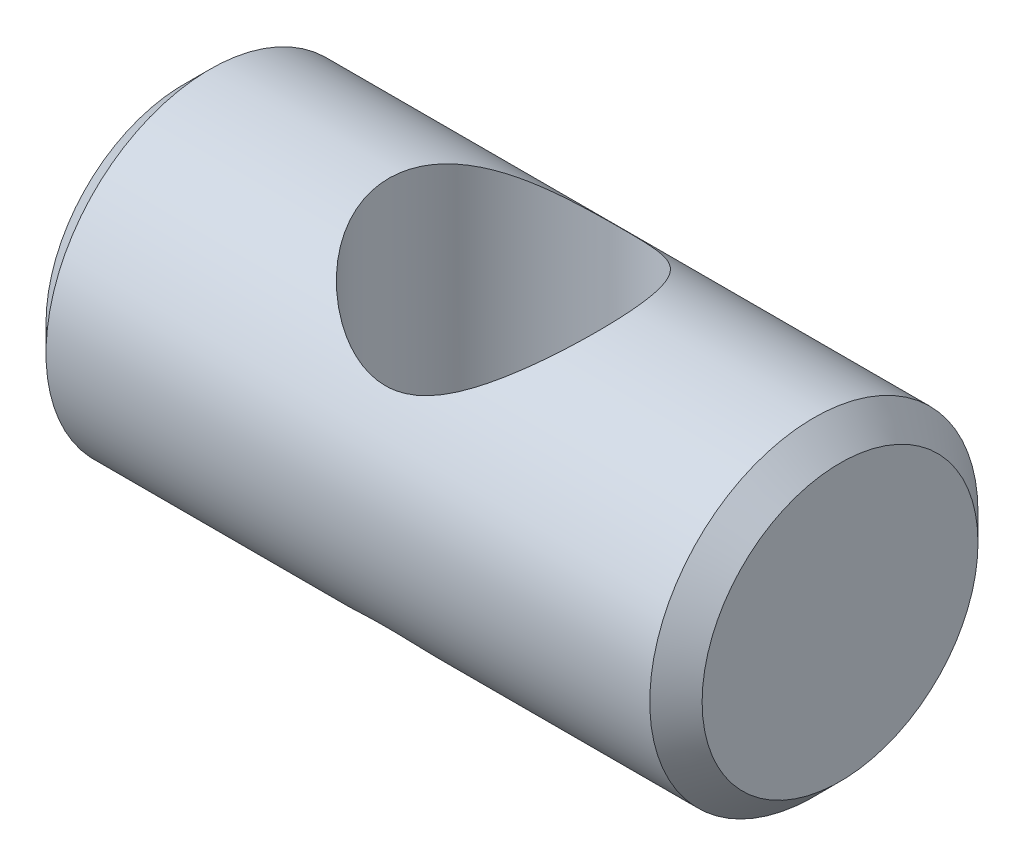
ISO-10303-21;
HEADER;
FILE_DESCRIPTION(('STEP AP214'),'2;1');
FILE_NAME('part.step','',(''),(''),'','','');
FILE_SCHEMA(('AUTOMOTIVE_DESIGN { 1 0 10303 214 1 1 1 1 }'));
ENDSEC;
DATA;
#1=APPLICATION_CONTEXT('core data for automotive mechanical design processes');
#2=APPLICATION_PROTOCOL_DEFINITION('international standard','automotive_design',2000,#1);
#3=PRODUCT_CONTEXT('',#1,'mechanical');
#4=PRODUCT('Part','Part','',(#3));
#5=PRODUCT_RELATED_PRODUCT_CATEGORY('part','',(#4));
#6=PRODUCT_DEFINITION_FORMATION('','',#4);
#7=PRODUCT_DEFINITION_CONTEXT('part definition',#1,'design');
#8=PRODUCT_DEFINITION('design','',#6,#7);
#9=PRODUCT_DEFINITION_SHAPE('','',#8);
#10=(LENGTH_UNIT() NAMED_UNIT(*) SI_UNIT(.MILLI.,.METRE.));
#11=(NAMED_UNIT(*) PLANE_ANGLE_UNIT() SI_UNIT($,.RADIAN.));
#12=(NAMED_UNIT(*) SI_UNIT($,.STERADIAN.) SOLID_ANGLE_UNIT());
#13=UNCERTAINTY_MEASURE_WITH_UNIT(LENGTH_MEASURE(1.E-05),#10,'distance_accuracy_value','');
#14=(GEOMETRIC_REPRESENTATION_CONTEXT(3) GLOBAL_UNCERTAINTY_ASSIGNED_CONTEXT((#13)) GLOBAL_UNIT_ASSIGNED_CONTEXT((#10,
#11,#12)) REPRESENTATION_CONTEXT('',''));
#15=CARTESIAN_POINT('',(0.,0.,0.));
#16=DIRECTION('',(0.,0.,1.));
#17=DIRECTION('',(1.,0.,0.));
#18=AXIS2_PLACEMENT_3D('',#15,#16,#17);
#19=CARTESIAN_POINT('',(9.525,0.,0.));
#20=DIRECTION('',(-1.,0.,0.));
#21=DIRECTION('',(0.,0.,1.));
#22=AXIS2_PLACEMENT_3D('',#19,#20,#21);
#23=CYLINDRICAL_SURFACE('',#22,4.765);
#24=CARTESIAN_POINT('',(-3.42087708051605,-4.765,0.));
#25=CARTESIAN_POINT('',(-3.42696899134863,-4.7649997101109,0.0833627581168182));
#26=CARTESIAN_POINT('',(-3.43001003086423,-4.76280757869707,0.166953392424251));
#27=CARTESIAN_POINT('',(-3.4299899120654,-4.75402028790231,0.333933182408653));
#28=CARTESIAN_POINT('',(-3.42692615604904,-4.74742325494959,0.41732223719261));
#29=CARTESIAN_POINT('',(-3.41478160746824,-4.72989865727235,0.583312250165057));
#30=CARTESIAN_POINT('',(-3.40569315136156,-4.71896558414041,0.665912068503747));
#31=CARTESIAN_POINT('',(-3.38168739143667,-4.69295834085159,0.829610597514772));
#32=CARTESIAN_POINT('',(-3.36676760565251,-4.67788240819801,0.91070865358331));
#33=CARTESIAN_POINT('',(-3.31382161536753,-4.62699847385246,1.15000632689336));
#34=CARTESIAN_POINT('',(-3.26752778272676,-4.58542013528299,1.30524951697123));
#35=CARTESIAN_POINT('',(-3.15544383432779,-4.48962808746058,1.60411463212557));
#36=CARTESIAN_POINT('',(-3.08965416222603,-4.43541466574349,1.74773682156028));
#37=CARTESIAN_POINT('',(-2.93522566350036,-4.31273538578719,2.03259497643689));
#38=CARTESIAN_POINT('',(-2.84518090003159,-4.24347672491827,2.17272279857911));
#39=CARTESIAN_POINT('',(-2.64803347355049,-4.09784606286129,2.43631552731587));
#40=CARTESIAN_POINT('',(-2.54091313456509,-4.02146672501527,2.55976291960052));
#41=CARTESIAN_POINT('',(-2.28757037498761,-3.84950291536883,2.81327393100644));
#42=CARTESIAN_POINT('',(-2.13784494064544,-3.75321839663728,2.93940806717613));
#43=CARTESIAN_POINT('',(-1.89774924473951,-3.61188607024724,3.10885207016274));
#44=CARTESIAN_POINT('',(-1.81509327318893,-3.56527135977744,3.16205944901992));
#45=CARTESIAN_POINT('',(-1.64456461914389,-3.47438917550769,3.26165283895997));
#46=CARTESIAN_POINT('',(-1.55669391813204,-3.43012082209568,3.30804141803447));
#47=CARTESIAN_POINT('',(-1.33801732923479,-3.32784018306176,3.41144333221737));
#48=CARTESIAN_POINT('',(-1.20454764001564,-3.27176419567389,3.46485738281701));
#49=CARTESIAN_POINT('',(-0.927567219273259,-3.17315327144381,3.55539465585279));
#50=CARTESIAN_POINT('',(-0.784080947165172,-3.13058666617785,3.59255605597934));
#51=CARTESIAN_POINT('',(-0.514646140223209,-3.07113542283653,3.64343651296181));
#52=CARTESIAN_POINT('',(-0.389980532152303,-3.05107413064414,3.66010628533956));
#53=CARTESIAN_POINT('',(-0.13805144197163,-3.02761567970702,3.67954153570878));
#54=CARTESIAN_POINT('',(-0.010790737951865,-3.02420155283186,3.68232117171679));
#55=CARTESIAN_POINT('',(0.242449329866106,-3.03458366659267,3.67376621747767));
#56=CARTESIAN_POINT('',(0.368429244158409,-3.04837216824954,3.66243797397314));
#57=CARTESIAN_POINT('',(0.615927376424317,-3.09094772918142,3.62657095184853));
#58=CARTESIAN_POINT('',(0.737438661719832,-3.11975712134959,3.60201250089043));
#59=CARTESIAN_POINT('',(1.02486117239319,-3.20358122773375,3.52797021750044));
#60=CARTESIAN_POINT('',(1.18741075414518,-3.26453704351351,3.47231020523667));
#61=CARTESIAN_POINT('',(1.498121783823,-3.39961296516166,3.34017866781708));
#62=CARTESIAN_POINT('',(1.64623815847782,-3.47377238661047,3.2636446149314));
#63=CARTESIAN_POINT('',(1.87825971607124,-3.60054284241464,3.12200897105521));
#64=CARTESIAN_POINT('',(1.9664324955114,-3.65156363596669,3.06234750531042));
#65=CARTESIAN_POINT('',(2.13658829521524,-3.75440484501345,2.93536296354977));
#66=CARTESIAN_POINT('',(2.21856944344932,-3.80622549668558,2.86803758566651));
#67=CARTESIAN_POINT('',(2.4548169203279,-3.96070606463684,2.65493557738645));
#68=CARTESIAN_POINT('',(2.59972905493882,-4.06258137631192,2.4978237985218));
#69=CARTESIAN_POINT('',(2.83706621766583,-4.23718725327564,2.18575837138569));
#70=CARTESIAN_POINT('',(2.93424360521689,-4.31186637762032,2.03548298499758));
#71=CARTESIAN_POINT('',(3.10568912436017,-4.44824656330391,1.71702572980925));
#72=CARTESIAN_POINT('',(3.17999040299218,-4.50996636079323,1.54887024912961));
#73=CARTESIAN_POINT('',(3.29263516387729,-4.60778480850806,1.22389848309853));
#74=CARTESIAN_POINT('',(3.33468022800881,-4.64632732736096,1.06910753325384));
#75=CARTESIAN_POINT('',(3.39687013419293,-4.70801774696666,0.752190984217971));
#76=CARTESIAN_POINT('',(3.4170259792185,-4.73117337991453,0.590069112764687));
#77=CARTESIAN_POINT('',(3.43390286080123,-4.7606051003247,0.262598143568303));
#78=CARTESIAN_POINT('',(3.43055828056669,-4.76683385814853,0.0972412962651645));
#79=CARTESIAN_POINT('',(3.40010195996678,-4.76222706928004,-0.231024129353292));
#80=CARTESIAN_POINT('',(3.37298745129903,-4.75138953488968,-0.393932420256085));
#81=CARTESIAN_POINT('',(3.29795083571309,-4.71498049061455,-0.705514268669748));
#82=CARTESIAN_POINT('',(3.25098003249397,-4.69006694126301,-0.854498752183594));
#83=CARTESIAN_POINT('',(3.13840780618742,-4.6283363468626,-1.14256413370517));
#84=CARTESIAN_POINT('',(3.07280276883643,-4.59151699239254,-1.28164310390504));
#85=CARTESIAN_POINT('',(2.91796402171938,-4.50478911028579,-1.5605913242394));
#86=CARTESIAN_POINT('',(2.82706121692328,-4.45396042558585,-1.6992420339739));
#87=CARTESIAN_POINT('',(2.62789389216064,-4.34533105232054,-1.96045324775842));
#88=CARTESIAN_POINT('',(2.51961335554432,-4.28752394420402,-2.08299871660834));
#89=CARTESIAN_POINT('',(2.26753986981794,-4.15886196775128,-2.33061071233595));
#90=CARTESIAN_POINT('',(2.12084350362776,-4.08747815085455,-2.4524560274696));
#91=CARTESIAN_POINT('',(1.80818256348861,-3.94818744226299,-2.67091966387117));
#92=CARTESIAN_POINT('',(1.64221717999394,-3.88028069682256,-2.76753692468302));
#93=CARTESIAN_POINT('',(1.32363316444147,-3.76775877390234,-2.91829752704228));
#94=CARTESIAN_POINT('',(1.17388770573105,-3.72114907301219,-2.97693831230802));
#95=CARTESIAN_POINT('',(0.94182658133829,-3.66180847873486,-3.04915600293589));
#96=CARTESIAN_POINT('',(0.863255129060431,-3.64379412637323,-3.0706008978109));
#97=CARTESIAN_POINT('',(0.703992654043785,-3.61197174564401,-3.10797188341904));
#98=CARTESIAN_POINT('',(0.62330269473567,-3.59816164910818,-3.12390068817333));
#99=CARTESIAN_POINT('',(0.459495462666014,-3.57524455910332,-3.15010468685879));
#100=CARTESIAN_POINT('',(0.376361962516611,-3.5661861203942,-3.16032158062367));
#101=CARTESIAN_POINT('',(0.209195138832908,-3.55344451616001,-3.17464168800661));
#102=CARTESIAN_POINT('',(0.125162274904953,-3.54975872585817,-3.17874788699032));
#103=CARTESIAN_POINT('',(-0.0430393452037676,-3.54795587812489,-3.18076053743013));
#104=CARTESIAN_POINT('',(-0.127208095972437,-3.54983860412504,-3.17866722999483));
#105=CARTESIAN_POINT('',(-0.29484062899608,-3.55905933774995,-3.16833758034575));
#106=CARTESIAN_POINT('',(-0.378304441298768,-3.56639711165655,-3.16010150131517));
#107=CARTESIAN_POINT('',(-0.604314657609785,-3.59341005189328,-3.129430196119));
#108=CARTESIAN_POINT('',(-0.745494317394036,-3.61818171011667,-3.10101793603989));
#109=CARTESIAN_POINT('',(-1.02069983126741,-3.67972750014127,-3.02771937958645));
#110=CARTESIAN_POINT('',(-1.1547183301723,-3.71651370639189,-2.98281650470617));
#111=CARTESIAN_POINT('',(-1.46853642894096,-3.8153502491925,-2.8560768918245));
#112=CARTESIAN_POINT('',(-1.64398166227299,-3.88152734494911,-2.76664814536404));
#113=CARTESIAN_POINT('',(-1.97551522842484,-4.02033820070584,-2.56077346334119));
#114=CARTESIAN_POINT('',(-2.13156938380249,-4.09298298410994,-2.44428083509274));
#115=CARTESIAN_POINT('',(-2.42421216807333,-4.2373970566927,-2.18450650401399));
#116=CARTESIAN_POINT('',(-2.56052605726515,-4.30914323590253,-2.04090097393914));
#117=CARTESIAN_POINT('',(-2.80802181758102,-4.44318432752427,-1.72973058522059));
#118=CARTESIAN_POINT('',(-2.91923707314103,-4.50549175797245,-1.56219804304703));
#119=CARTESIAN_POINT('',(-3.09396462152009,-4.60338031575656,-1.23969583506405));
#120=CARTESIAN_POINT('',(-3.16252149709776,-4.64178783933997,-1.08834922542924));
#121=CARTESIAN_POINT('',(-3.24875451241662,-4.68864069192958,-0.853387810710919));
#122=CARTESIAN_POINT('',(-3.27471971164357,-4.70245945854321,-0.773800863355168));
#123=CARTESIAN_POINT('',(-3.32087000112459,-4.72618391319332,-0.612411306870996));
#124=CARTESIAN_POINT('',(-3.34105760799584,-4.73609130567107,-0.530609679466056));
#125=CARTESIAN_POINT('',(-3.37353939001354,-4.75084997254152,-0.374335243630175));
#126=CARTESIAN_POINT('',(-3.38645258471521,-4.75613339853629,-0.300030947704157));
#127=CARTESIAN_POINT('',(-3.40736829831093,-4.76320900575073,-0.150546671086999));
#128=CARTESIAN_POINT('',(-3.41536951590209,-4.76500026208246,-0.075366463716097));
#129=CARTESIAN_POINT('',(-3.42087708051605,-4.765,0.));
#130=B_SPLINE_CURVE_WITH_KNOTS('',3,(#24,#25,#26,#27,#28,#29,#30,#31,#32,#33,#34,#35,#36,#37,
#38,#39,#40,#41,#42,#43,#44,#45,#46,#47,#48,#49,#50,#51,#52,#53,#54,#55,#56,#57,#58,#59,#60,#61,
#62,#63,#64,#65,#66,#67,#68,#69,#70,#71,#72,#73,#74,#75,#76,#77,#78,#79,#80,#81,#82,#83,#84,#85,
#86,#87,#88,#89,#90,#91,#92,#93,#94,#95,#96,#97,#98,#99,#100,#101,#102,#103,#104,#105,#106,#107,
#108,#109,#110,#111,#112,#113,#114,#115,#116,#117,#118,#119,#120,#121,#122,#123,#124,#125,#126,
#127,#128,#129),.UNSPECIFIED.,.T.,.F.,(4,2,2,2,2,2,2,2,2,2,2,2,2,2,2,2,2,2,2,2,2,2,2,2,2,2,2,2,
2,2,2,2,2,2,2,2,2,2,2,2,2,2,2,2,2,2,2,2,2,2,2,2,4),(0.,0.250678148817341,0.501462988541287,
0.752567445437253,1.00377889552888,1.50309474088369,2.00239922444642,2.54160992918404,
3.08138247258981,3.73300244855075,4.05909733145616,4.38506908912952,4.84654436743379,
5.30692973453839,5.68734604359481,6.06737452056514,6.44723209503533,6.82765605484285,
7.37157480546313,7.91714109472133,8.27090631470675,8.62477807035776,9.33119791439566,
9.91077027397039,10.4894988486046,10.9822712500665,11.4747958366297,11.9686961727678,
12.4626540373564,12.9352342359093,13.4079061579591,13.9261848288361,14.4449439577641,
15.0533142145202,15.6617100398796,16.1619385675779,16.4119146790501,16.6617676221917,
16.9141262556176,17.1663615593023,17.4185870532858,17.6708017414467,18.1072101440206,
18.5440584873629,19.1640002904501,19.7850197135797,20.4139885307568,21.0421157411608,
21.5513660687497,21.8056438515067,22.059810706191,22.2863833912941,22.5130160751694),.UNSPECIFIED.);
#131=CARTESIAN_POINT('',(-3.42087708051605,-4.765,0.));
#132=VERTEX_POINT('',#131);
#133=EDGE_CURVE('E10',#132,#132,#130,.T.);
#134=ORIENTED_EDGE('',*,*,#133,.T.);
#135=EDGE_LOOP('',(#134));
#136=FACE_BOUND('',#135,.T.);
#137=CARTESIAN_POINT('',(0.,3.02701585724291,3.68));
#138=CARTESIAN_POINT('',(-0.0785672773316466,3.02701614791727,3.67999984364138));
#139=CARTESIAN_POINT('',(-0.157136135576355,3.03031605642996,3.67729277636747));
#140=CARTESIAN_POINT('',(-0.313369541449519,3.04330147157753,3.66655295600809));
#141=CARTESIAN_POINT('',(-0.391034010912772,3.05298752605126,3.65851974601636));
#142=CARTESIAN_POINT('',(-0.544942339151606,3.07820352988238,3.63732812874269));
#143=CARTESIAN_POINT('',(-0.621180877977561,3.09375201630091,3.62415345944192));
#144=CARTESIAN_POINT('',(-0.771468880528867,3.12988210454059,3.59299821855179));
#145=CARTESIAN_POINT('',(-0.845516665983407,3.15046745848851,3.57501406328682));
#146=CARTESIAN_POINT('',(-1.09433047382612,3.22791462831318,3.50587087765695));
#147=CARTESIAN_POINT('',(-1.26309282362243,3.2948386580286,3.44382003292069));
#148=CARTESIAN_POINT('',(-1.50370711041474,3.40467601246938,3.33408533723919));
#149=CARTESIAN_POINT('',(-1.58189244838754,3.44290479326835,3.29468500807198));
#150=CARTESIAN_POINT('',(-1.73423285237257,3.52148653298938,3.21055545325705));
#151=CARTESIAN_POINT('',(-1.80838881793449,3.56183901380659,3.16582742418489));
#152=CARTESIAN_POINT('',(-2.02850482582811,3.68672600847628,3.02153691887044));
#153=CARTESIAN_POINT('',(-2.16807869449587,3.77315168849593,2.9137218740972));
#154=CARTESIAN_POINT('',(-2.42959010373283,3.94426933228633,2.67754924945123));
#155=CARTESIAN_POINT('',(-2.55153658554773,4.0289621561759,2.54920215427041));
#156=CARTESIAN_POINT('',(-2.77693730786715,4.1919505214112,2.27132648174838));
#157=CARTESIAN_POINT('',(-2.88023478105728,4.27018907543984,2.12163570850646));
#158=CARTESIAN_POINT('',(-3.06369900830999,4.41409842691616,1.80316374111449));
#159=CARTESIAN_POINT('',(-3.14388622560065,4.47978032533083,1.63439962117957));
#160=CARTESIAN_POINT('',(-3.26635689009236,4.58439476517905,1.30881127520956));
#161=CARTESIAN_POINT('',(-3.3126324755552,4.62591646772975,1.15433056577145));
#162=CARTESIAN_POINT('',(-3.38325654959983,4.69367027218436,0.837202280830254));
#163=CARTESIAN_POINT('',(-3.40762001451853,4.7199128126465,0.674560363681942));
#164=CARTESIAN_POINT('',(-3.43267527752513,4.75538994748078,0.345016918949486));
#165=CARTESIAN_POINT('',(-3.43328564995364,4.76456593536209,0.178102701594286));
#166=CARTESIAN_POINT('',(-3.41018166140548,4.76540378920208,-0.154080808504466));
#167=CARTESIAN_POINT('',(-3.38646547727926,4.75706434242047,-0.319349977022772));
#168=CARTESIAN_POINT('',(-3.31775156953333,4.72510260499364,-0.634317782486346));
#169=CARTESIAN_POINT('',(-3.27397352746067,4.70233080305011,-0.784375176401478));
#170=CARTESIAN_POINT('',(-3.16750864597913,4.64450941494238,-1.07505429218324));
#171=CARTESIAN_POINT('',(-3.10481828431147,4.60945754152293,-1.21567425043883));
#172=CARTESIAN_POINT('',(-2.95652856255593,4.52638674091888,-1.49677788855974));
#173=CARTESIAN_POINT('',(-2.86942133720827,4.47751111873768,-1.63620711351601));
#174=CARTESIAN_POINT('',(-2.67788120319372,4.37232420780869,-1.89951272145431));
#175=CARTESIAN_POINT('',(-2.57343424063936,4.31600689517522,-2.02337634423388));
#176=CARTESIAN_POINT('',(-2.32992989714121,4.18996971318213,-2.27426780979749));
#177=CARTESIAN_POINT('',(-2.18800876851398,4.11960732735628,-2.39819784816123));
#178=CARTESIAN_POINT('',(-1.88505782163776,3.98107848473248,-2.62174133186739));
#179=CARTESIAN_POINT('',(-1.72402241690679,3.91291267736107,-2.72134764203992));
#180=CARTESIAN_POINT('',(-1.40961518716303,3.79636450990898,-2.881168849186));
#181=CARTESIAN_POINT('',(-1.25863725138286,3.74654731116981,-2.94503209171547));
#182=CARTESIAN_POINT('',(-0.945527440392476,3.66060402226399,-3.05121747931762));
#183=CARTESIAN_POINT('',(-0.783414037013453,3.62445587601066,-3.09357436476774));
#184=CARTESIAN_POINT('',(-0.533813056438613,3.58476149841442,-3.13928376884266));
#185=CARTESIAN_POINT('',(-0.449028547115524,3.57393161480045,-3.15156761613341));
#186=CARTESIAN_POINT('',(-0.278275024285711,3.55780077117141,-3.16976872881678));
#187=CARTESIAN_POINT('',(-0.192306660171834,3.5524968934398,-3.17568935402606));
#188=CARTESIAN_POINT('',(-0.020032770904315,3.54772147962291,-3.18102355866001));
#189=CARTESIAN_POINT('',(0.0662726316081444,3.54824798964232,-3.18043931801256));
#190=CARTESIAN_POINT('',(0.238338872801625,3.55508375410915,-3.17279435887041));
#191=CARTESIAN_POINT('',(0.324099748085624,3.56139261563451,-3.16573408043507));
#192=CARTESIAN_POINT('',(0.553401842306173,3.58576306843395,-3.13816835119393));
#193=CARTESIAN_POINT('',(0.69573919740344,3.60894237647337,-3.11173256017326));
#194=CARTESIAN_POINT('',(0.973480788870408,3.6678298405413,-3.04208625520151));
#195=CARTESIAN_POINT('',(1.10887734054378,3.70355155394913,-2.99885758403296));
#196=CARTESIAN_POINT('',(1.42379146726814,3.7997001514418,-2.87675019956371));
#197=CARTESIAN_POINT('',(1.59919673865542,3.86428769996493,-2.79052654374781));
#198=CARTESIAN_POINT('',(1.93113815119942,4.00059813210694,-2.59133845951309));
#199=CARTESIAN_POINT('',(2.08764088718698,4.07233325050109,-2.47832770642991));
#200=CARTESIAN_POINT('',(2.38199709911893,4.21579037939226,-2.22570370446708));
#201=CARTESIAN_POINT('',(2.51955338419097,4.28749766673045,-2.08573466326166));
#202=CARTESIAN_POINT('',(2.77028243502779,4.42234806198233,-1.78201502187867));
#203=CARTESIAN_POINT('',(2.88349257282064,4.48550424008068,-1.61830152645774));
#204=CARTESIAN_POINT('',(3.06402610957439,4.58658548395503,-1.30045140866569));
#205=CARTESIAN_POINT('',(3.13591982023922,4.62699541781642,-1.1497087789086));
#206=CARTESIAN_POINT('',(3.25766051296821,4.69370617156705,-0.836599849304389));
#207=CARTESIAN_POINT('',(3.30752205037566,4.7200163088041,-0.674241306034806));
#208=CARTESIAN_POINT('',(3.3829870904449,4.75572615385405,-0.341241432427482));
#209=CARTESIAN_POINT('',(3.40846923089666,4.7650414665297,-0.170563063438744));
#210=CARTESIAN_POINT('',(3.4334390909829,4.76495829995348,0.172677006169809));
#211=CARTESIAN_POINT('',(3.43293306367628,4.7555643228997,0.345238243758836));
#212=CARTESIAN_POINT('',(3.40754400048731,4.71998636563285,0.67212649572784));
#213=CARTESIAN_POINT('',(3.38468468821344,4.69525837988108,0.826779473459491));
#214=CARTESIAN_POINT('',(3.31910619707247,4.63193340521078,1.12882616508402));
#215=CARTESIAN_POINT('',(3.27638180384756,4.59333277548538,1.27621796175838));
#216=CARTESIAN_POINT('',(3.17042951924722,4.50215126554465,1.5686260572414));
#217=CARTESIAN_POINT('',(3.10621371599284,4.44892473542071,1.71307815224114));
#218=CARTESIAN_POINT('',(2.96073945861412,4.33272638873523,1.98874620073681));
#219=CARTESIAN_POINT('',(2.87947919610232,4.26975353829207,2.11996074756245));
#220=CARTESIAN_POINT('',(2.68651050838254,4.12556821291774,2.39003735747662));
#221=CARTESIAN_POINT('',(2.57196063848181,4.04309554925752,2.52618739114483));
#222=CARTESIAN_POINT('',(2.32447412944916,3.87408431941462,2.77844859407009));
#223=CARTESIAN_POINT('',(2.19149095139184,3.78753584009048,2.89450731580785));
#224=CARTESIAN_POINT('',(1.96595276183287,3.65130486353125,3.06263487303052));
#225=CARTESIAN_POINT('',(1.87886470860019,3.60090149373494,3.12157066922301));
#226=CARTESIAN_POINT('',(1.69862262017005,3.50236607543005,3.23173475735497));
#227=CARTESIAN_POINT('',(1.60546616441238,3.45423494663789,3.28295994638551));
#228=CARTESIAN_POINT('',(1.41335402823623,3.36225362869259,3.37709887635029));
#229=CARTESIAN_POINT('',(1.31441341048654,3.31839304937429,3.4200330530899));
#230=CARTESIAN_POINT('',(1.11061583662532,3.23713845030014,3.49704051581634));
#231=CARTESIAN_POINT('',(1.00576424358736,3.19973868995705,3.53112168161428));
#232=CARTESIAN_POINT('',(0.826860618617418,3.1451674862639,3.57966454279998));
#233=CARTESIAN_POINT('',(0.754330914941613,3.12542579098052,3.59686794878708));
#234=CARTESIAN_POINT('',(0.607204587985835,3.09080711138969,3.62665947956898));
#235=CARTESIAN_POINT('',(0.532609008476296,3.07592771737776,3.63924989089071));
#236=CARTESIAN_POINT('',(0.38209665983941,3.05181598122002,3.65949364139542));
#237=CARTESIAN_POINT('',(0.306185151895193,3.04256489437812,3.66716337327478));
#238=CARTESIAN_POINT('',(0.153516252829605,3.03016475948479,3.67741657137031));
#239=CARTESIAN_POINT('',(0.0767588809019638,3.02701557325904,3.68000015275969));
#240=CARTESIAN_POINT('',(0.,3.02701585724291,3.68));
#241=B_SPLINE_CURVE_WITH_KNOTS('',3,(#137,#138,#139,#140,#141,#142,#143,#144,#145,#146,#147,
#148,#149,#150,#151,#152,#153,#154,#155,#156,#157,#158,#159,#160,#161,#162,#163,#164,#165,#166,
#167,#168,#169,#170,#171,#172,#173,#174,#175,#176,#177,#178,#179,#180,#181,#182,#183,#184,#185,
#186,#187,#188,#189,#190,#191,#192,#193,#194,#195,#196,#197,#198,#199,#200,#201,#202,#203,#204,
#205,#206,#207,#208,#209,#210,#211,#212,#213,#214,#215,#216,#217,#218,#219,#220,#221,#222,#223,
#224,#225,#226,#227,#228,#229,#230,#231,#232,#233,#234,#235,#236,#237,#238,#239,#240),
.UNSPECIFIED.,.T.,.F.,(4,2,2,2,2,2,2,2,2,2,2,2,2,2,2,2,2,2,2,2,2,2,2,2,2,2,2,2,2,2,2,2,2,2,2,2,
2,2,2,2,2,2,2,2,2,2,2,2,2,2,2,4),(0.,0.235591708988226,0.471203630963838,0.707566894291256,
0.944106771258296,1.51591397043087,1.80236618274396,2.08875418016066,2.67592975620556,
3.26280644257576,3.85440755326201,4.44548320346413,4.94292664174491,5.44002983205938,
5.93883694376225,6.43768144120931,6.9095606777859,7.38152785217115,7.89413675044232,
8.40716316586385,9.00813916387887,9.60929124216605,10.1214610992978,10.6328009675269,
10.8914987801306,11.1500599316432,11.4085344360666,11.6669913779457,12.1048085655683,
12.5431004643861,13.1573710774192,13.7727118402267,14.3968121302921,15.0199474601663,
15.5333029695888,16.0463188267164,16.5618754223646,17.077307969612,17.550023970907,
18.0228641248864,18.5213957266873,19.0199802486027,19.6062313855034,20.1939905554461,
20.5434646283834,20.8930789631276,21.2418202453876,21.5902500511245,21.8213124314337,
22.0522601254179,22.2824343920731,22.5126034464923),.UNSPECIFIED.);
#242=CARTESIAN_POINT('',(0.,3.02701585724291,3.68));
#243=VERTEX_POINT('',#242);
#244=EDGE_CURVE('E42',#243,#243,#241,.T.);
#245=ORIENTED_EDGE('',*,*,#244,.T.);
#246=EDGE_LOOP('',(#245));
#247=FACE_BOUND('',#246,.T.);
#248=CARTESIAN_POINT('',(-8.76499999999999,0.,0.));
#249=DIRECTION('',(1.,0.,0.));
#250=DIRECTION('',(0.,0.,-1.));
#251=AXIS2_PLACEMENT_3D('',#248,#249,#250);
#252=CIRCLE('',#251,4.765);
#253=CARTESIAN_POINT('',(-8.76499999999999,0.,-4.765));
#254=VERTEX_POINT('',#253);
#255=EDGE_CURVE('E82',#254,#254,#252,.T.);
#256=ORIENTED_EDGE('',*,*,#255,.T.);
#257=EDGE_LOOP('',(#256));
#258=FACE_BOUND('',#257,.T.);
#259=CARTESIAN_POINT('',(8.76500000000001,0.,0.));
#260=DIRECTION('',(1.,0.,0.));
#261=DIRECTION('',(0.,0.,-1.));
#262=AXIS2_PLACEMENT_3D('',#259,#260,#261);
#263=CIRCLE('',#262,4.765);
#264=CARTESIAN_POINT('',(8.76500000000001,0.,-4.765));
#265=VERTEX_POINT('',#264);
#266=EDGE_CURVE('E85',#265,#265,#263,.F.);
#267=ORIENTED_EDGE('',*,*,#266,.T.);
#268=EDGE_LOOP('',(#267));
#269=FACE_BOUND('',#268,.T.);
#270=ADVANCED_FACE('F31',(#136,#247,#258,#269),#23,.T.);
#271=CARTESIAN_POINT('',(9.525,0.,0.));
#272=DIRECTION('',(1.,0.,0.));
#273=DIRECTION('',(0.,0.,-1.));
#274=AXIS2_PLACEMENT_3D('',#271,#272,#273);
#275=PLANE('',#274);
#276=CARTESIAN_POINT('',(9.525,0.,0.));
#277=DIRECTION('',(1.,0.,0.));
#278=DIRECTION('',(0.,0.,-1.));
#279=AXIS2_PLACEMENT_3D('',#276,#277,#278);
#280=CIRCLE('',#279,4.00500000000001);
#281=CARTESIAN_POINT('',(9.525,0.,-4.00500000000001));
#282=VERTEX_POINT('',#281);
#283=EDGE_CURVE('E46',#282,#282,#280,.T.);
#284=ORIENTED_EDGE('',*,*,#283,.T.);
#285=EDGE_LOOP('',(#284));
#286=FACE_BOUND('',#285,.T.);
#287=ADVANCED_FACE('F62',(#286),#275,.T.);
#288=CARTESIAN_POINT('',(-9.525,0.,0.));
#289=DIRECTION('',(1.,0.,0.));
#290=DIRECTION('',(0.,0.,-1.));
#291=AXIS2_PLACEMENT_3D('',#288,#289,#290);
#292=PLANE('',#291);
#293=CARTESIAN_POINT('',(-9.525,0.,0.));
#294=DIRECTION('',(1.,0.,0.));
#295=DIRECTION('',(0.,0.,-1.));
#296=AXIS2_PLACEMENT_3D('',#293,#294,#295);
#297=CIRCLE('',#296,4.00499999999998);
#298=CARTESIAN_POINT('',(-9.525,0.,-4.00499999999998));
#299=VERTEX_POINT('',#298);
#300=EDGE_CURVE('E50',#299,#299,#297,.F.);
#301=ORIENTED_EDGE('',*,*,#300,.T.);
#302=EDGE_LOOP('',(#301));
#303=FACE_BOUND('',#302,.T.);
#304=ADVANCED_FACE('F65',(#303),#292,.F.);
#305=CARTESIAN_POINT('',(-8.76499999999999,0.,0.));
#306=DIRECTION('',(1.,0.,0.));
#307=DIRECTION('',(0.,0.,-1.));
#308=AXIS2_PLACEMENT_3D('',#305,#306,#307);
#309=CONICAL_SURFACE('',#308,4.765,0.785398163397451);
#310=ORIENTED_EDGE('',*,*,#300,.F.);
#311=EDGE_LOOP('',(#310));
#312=FACE_BOUND('',#311,.T.);
#313=ORIENTED_EDGE('',*,*,#255,.F.);
#314=EDGE_LOOP('',(#313));
#315=FACE_BOUND('',#314,.T.);
#316=ADVANCED_FACE('F68',(#312,#315),#309,.T.);
#317=CARTESIAN_POINT('',(9.525,0.,0.));
#318=DIRECTION('',(-1.,0.,0.));
#319=DIRECTION('',(0.,0.,1.));
#320=AXIS2_PLACEMENT_3D('',#317,#318,#319);
#321=CONICAL_SURFACE('',#320,4.00500000000001,0.785398163397448);
#322=ORIENTED_EDGE('',*,*,#266,.F.);
#323=EDGE_LOOP('',(#322));
#324=FACE_BOUND('',#323,.T.);
#325=ORIENTED_EDGE('',*,*,#283,.F.);
#326=EDGE_LOOP('',(#325));
#327=FACE_BOUND('',#326,.T.);
#328=ADVANCED_FACE('F33',(#324,#327),#321,.T.);
#329=CARTESIAN_POINT('',(0.,-4.765,0.25));
#330=DIRECTION('',(0.,1.,0.));
#331=DIRECTION('',(0.,0.,1.));
#332=AXIS2_PLACEMENT_3D('',#329,#330,#331);
#333=CYLINDRICAL_SURFACE('',#332,3.43);
#334=ORIENTED_EDGE('',*,*,#244,.F.);
#335=EDGE_LOOP('',(#334));
#336=FACE_BOUND('',#335,.T.);
#337=ORIENTED_EDGE('',*,*,#133,.F.);
#338=EDGE_LOOP('',(#337));
#339=FACE_BOUND('',#338,.T.);
#340=ADVANCED_FACE('F57',(#336,#339),#333,.F.);
#341=CLOSED_SHELL('',(#270,#287,#304,#316,#328,#340));
#342=MANIFOLD_SOLID_BREP('B2',#341);
#343=ADVANCED_BREP_SHAPE_REPRESENTATION('',(#18,#342),#14);
#344=SHAPE_DEFINITION_REPRESENTATION(#9,#343);
ENDSEC;
END-ISO-10303-21;
